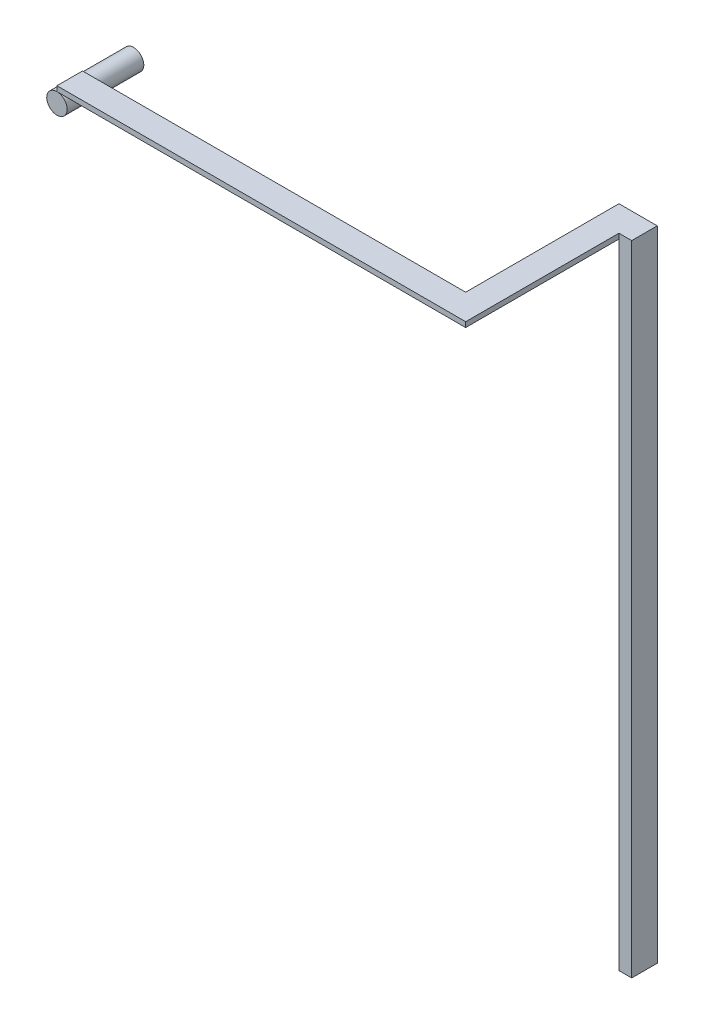
ISO-10303-21;
HEADER;
FILE_DESCRIPTION(('STEP AP214'),'2;1');
FILE_NAME('part.step','',(''),(''),'','','');
FILE_SCHEMA(('AUTOMOTIVE_DESIGN { 1 0 10303 214 1 1 1 1 }'));
ENDSEC;
DATA;
#1=APPLICATION_CONTEXT('core data for automotive mechanical design processes');
#2=APPLICATION_PROTOCOL_DEFINITION('international standard','automotive_design',2000,#1);
#3=PRODUCT_CONTEXT('',#1,'mechanical');
#4=PRODUCT('Part','Part','',(#3));
#5=PRODUCT_RELATED_PRODUCT_CATEGORY('part','',(#4));
#6=PRODUCT_DEFINITION_FORMATION('','',#4);
#7=PRODUCT_DEFINITION_CONTEXT('part definition',#1,'design');
#8=PRODUCT_DEFINITION('design','',#6,#7);
#9=PRODUCT_DEFINITION_SHAPE('','',#8);
#10=(LENGTH_UNIT() NAMED_UNIT(*) SI_UNIT(.MILLI.,.METRE.));
#11=(NAMED_UNIT(*) PLANE_ANGLE_UNIT() SI_UNIT($,.RADIAN.));
#12=(NAMED_UNIT(*) SI_UNIT($,.STERADIAN.) SOLID_ANGLE_UNIT());
#13=UNCERTAINTY_MEASURE_WITH_UNIT(LENGTH_MEASURE(1.E-05),#10,'distance_accuracy_value','');
#14=(GEOMETRIC_REPRESENTATION_CONTEXT(3) GLOBAL_UNCERTAINTY_ASSIGNED_CONTEXT((#13)) GLOBAL_UNIT_ASSIGNED_CONTEXT((#10,
#11,#12)) REPRESENTATION_CONTEXT('',''));
#15=CARTESIAN_POINT('',(0.,0.,0.));
#16=DIRECTION('',(0.,0.,1.));
#17=DIRECTION('',(1.,0.,0.));
#18=AXIS2_PLACEMENT_3D('',#15,#16,#17);
#19=CARTESIAN_POINT('',(0.,4.,20.));
#20=DIRECTION('',(-1.,0.,0.));
#21=DIRECTION('',(0.,0.,1.));
#22=AXIS2_PLACEMENT_3D('',#19,#20,#21);
#23=PLANE('',#22);
#24=DIRECTION('',(0.,-1.,0.));
#25=VECTOR('',#24,1.);
#26=CARTESIAN_POINT('',(0.,4.,30.));
#27=LINE('',#26,#25);
#28=CARTESIAN_POINT('',(0.,6.,30.));
#29=VERTEX_POINT('',#28);
#30=CARTESIAN_POINT('',(0.,4.,30.));
#31=VERTEX_POINT('',#30);
#32=EDGE_CURVE('E169',#29,#31,#27,.T.);
#33=ORIENTED_EDGE('',*,*,#32,.F.);
#34=DIRECTION('',(0.,0.,1.));
#35=VECTOR('',#34,1.);
#36=CARTESIAN_POINT('',(0.,6.,20.));
#37=LINE('',#36,#35);
#38=CARTESIAN_POINT('',(0.,6.,20.));
#39=VERTEX_POINT('',#38);
#40=EDGE_CURVE('E12',#39,#29,#37,.T.);
#41=ORIENTED_EDGE('',*,*,#40,.F.);
#42=DIRECTION('',(0.,-1.,0.));
#43=VECTOR('',#42,1.);
#44=CARTESIAN_POINT('',(0.,4.,20.));
#45=LINE('',#44,#43);
#46=CARTESIAN_POINT('',(0.,4.,20.));
#47=VERTEX_POINT('',#46);
#48=EDGE_CURVE('E170',#39,#47,#45,.T.);
#49=ORIENTED_EDGE('',*,*,#48,.T.);
#50=DIRECTION('',(0.,0.,1.));
#51=VECTOR('',#50,1.);
#52=CARTESIAN_POINT('',(0.,4.,20.));
#53=LINE('',#52,#51);
#54=EDGE_CURVE('E44',#47,#31,#53,.T.);
#55=ORIENTED_EDGE('',*,*,#54,.T.);
#56=EDGE_LOOP('',(#33,#41,#49,#55));
#57=FACE_BOUND('',#56,.T.);
#58=ADVANCED_FACE('F41',(#57),#23,.T.);
#59=CARTESIAN_POINT('',(0.,6.,20.));
#60=DIRECTION('',(0.,1.,0.));
#61=DIRECTION('',(0.,0.,1.));
#62=AXIS2_PLACEMENT_3D('',#59,#60,#61);
#63=PLANE('',#62);
#64=DIRECTION('',(-1.,0.,0.));
#65=VECTOR('',#64,1.);
#66=CARTESIAN_POINT('',(0.,6.,30.));
#67=LINE('',#66,#65);
#68=CARTESIAN_POINT('',(160.,6.,30.));
#69=VERTEX_POINT('',#68);
#70=EDGE_CURVE('E174',#69,#29,#67,.T.);
#71=ORIENTED_EDGE('',*,*,#70,.F.);
#72=DIRECTION('',(0.,0.,1.));
#73=VECTOR('',#72,1.);
#74=CARTESIAN_POINT('',(160.,6.,20.));
#75=LINE('',#74,#73);
#76=CARTESIAN_POINT('',(160.,6.,-30.));
#77=VERTEX_POINT('',#76);
#78=EDGE_CURVE('E49',#77,#69,#75,.T.);
#79=ORIENTED_EDGE('',*,*,#78,.F.);
#80=DIRECTION('',(-1.,0.,0.));
#81=VECTOR('',#80,1.);
#82=CARTESIAN_POINT('',(165.,6.,-30.));
#83=LINE('',#82,#81);
#84=CARTESIAN_POINT('',(165.,6.,-30.));
#85=VERTEX_POINT('',#84);
#86=EDGE_CURVE('E135',#85,#77,#83,.T.);
#87=ORIENTED_EDGE('',*,*,#86,.F.);
#88=DIRECTION('',(0.,0.,1.));
#89=VECTOR('',#88,1.);
#90=CARTESIAN_POINT('',(165.,6.,-40.));
#91=LINE('',#90,#89);
#92=CARTESIAN_POINT('',(165.,6.,-40.));
#93=VERTEX_POINT('',#92);
#94=EDGE_CURVE('E131',#93,#85,#91,.T.);
#95=ORIENTED_EDGE('',*,*,#94,.F.);
#96=DIRECTION('',(1.,0.,0.));
#97=VECTOR('',#96,1.);
#98=CARTESIAN_POINT('',(150.,6.,-40.));
#99=LINE('',#98,#97);
#100=CARTESIAN_POINT('',(150.,6.,-40.));
#101=VERTEX_POINT('',#100);
#102=EDGE_CURVE('E117',#101,#93,#99,.T.);
#103=ORIENTED_EDGE('',*,*,#102,.F.);
#104=DIRECTION('',(0.,0.,1.));
#105=VECTOR('',#104,1.);
#106=CARTESIAN_POINT('',(150.,6.,-40.));
#107=LINE('',#106,#105);
#108=CARTESIAN_POINT('',(150.,6.,20.));
#109=VERTEX_POINT('',#108);
#110=EDGE_CURVE('E167',#101,#109,#107,.T.);
#111=ORIENTED_EDGE('',*,*,#110,.T.);
#112=DIRECTION('',(-1.,0.,0.));
#113=VECTOR('',#112,1.);
#114=CARTESIAN_POINT('',(0.,6.,20.));
#115=LINE('',#114,#113);
#116=EDGE_CURVE('E176',#109,#39,#115,.T.);
#117=ORIENTED_EDGE('',*,*,#116,.T.);
#118=ORIENTED_EDGE('',*,*,#40,.T.);
#119=EDGE_LOOP('',(#71,#79,#87,#95,#103,#111,#117,#118));
#120=FACE_BOUND('',#119,.T.);
#121=ADVANCED_FACE('F133',(#120),#63,.T.);
#122=CARTESIAN_POINT('',(160.,4.,20.));
#123=DIRECTION('',(1.,0.,0.));
#124=DIRECTION('',(0.,0.,-1.));
#125=AXIS2_PLACEMENT_3D('',#122,#123,#124);
#126=PLANE('',#125);
#127=DIRECTION('',(0.,-1.,0.));
#128=VECTOR('',#127,1.);
#129=CARTESIAN_POINT('',(160.,6.,-30.));
#130=LINE('',#129,#128);
#131=CARTESIAN_POINT('',(160.,4.,-30.));
#132=VERTEX_POINT('',#131);
#133=EDGE_CURVE('E57',#77,#132,#130,.T.);
#134=ORIENTED_EDGE('',*,*,#133,.F.);
#135=ORIENTED_EDGE('',*,*,#78,.T.);
#136=DIRECTION('',(0.,1.,0.));
#137=VECTOR('',#136,1.);
#138=CARTESIAN_POINT('',(160.,4.,30.));
#139=LINE('',#138,#137);
#140=CARTESIAN_POINT('',(160.,4.,30.));
#141=VERTEX_POINT('',#140);
#142=EDGE_CURVE('E183',#141,#69,#139,.T.);
#143=ORIENTED_EDGE('',*,*,#142,.F.);
#144=DIRECTION('',(0.,0.,1.));
#145=VECTOR('',#144,1.);
#146=CARTESIAN_POINT('',(160.,4.,20.));
#147=LINE('',#146,#145);
#148=EDGE_CURVE('E189',#132,#141,#147,.T.);
#149=ORIENTED_EDGE('',*,*,#148,.F.);
#150=EDGE_LOOP('',(#134,#135,#143,#149));
#151=FACE_BOUND('',#150,.T.);
#152=ADVANCED_FACE('F219',(#151),#126,.T.);
#153=CARTESIAN_POINT('',(0.,4.,20.));
#154=DIRECTION('',(0.,-1.,0.));
#155=DIRECTION('',(0.,0.,-1.));
#156=AXIS2_PLACEMENT_3D('',#153,#154,#155);
#157=PLANE('',#156);
#158=DIRECTION('',(1.,0.,0.));
#159=VECTOR('',#158,1.);
#160=CARTESIAN_POINT('',(0.,4.,30.));
#161=LINE('',#160,#159);
#162=EDGE_CURVE('E180',#31,#141,#161,.T.);
#163=ORIENTED_EDGE('',*,*,#162,.F.);
#164=ORIENTED_EDGE('',*,*,#54,.F.);
#165=DIRECTION('',(1.,0.,0.));
#166=VECTOR('',#165,1.);
#167=CARTESIAN_POINT('',(0.,4.,20.));
#168=LINE('',#167,#166);
#169=CARTESIAN_POINT('',(150.,4.,20.));
#170=VERTEX_POINT('',#169);
#171=EDGE_CURVE('E173',#47,#170,#168,.T.);
#172=ORIENTED_EDGE('',*,*,#171,.T.);
#173=DIRECTION('',(0.,0.,1.));
#174=VECTOR('',#173,1.);
#175=CARTESIAN_POINT('',(150.,3.99999999999999,-40.));
#176=LINE('',#175,#174);
#177=CARTESIAN_POINT('',(150.,3.99999999999999,-40.));
#178=VERTEX_POINT('',#177);
#179=EDGE_CURVE('E163',#178,#170,#176,.T.);
#180=ORIENTED_EDGE('',*,*,#179,.F.);
#181=DIRECTION('',(-1.,0.,0.));
#182=VECTOR('',#181,1.);
#183=CARTESIAN_POINT('',(150.,3.99999999999999,-40.));
#184=LINE('',#183,#182);
#185=CARTESIAN_POINT('',(160.,4.,-40.));
#186=VERTEX_POINT('',#185);
#187=EDGE_CURVE('E128',#186,#178,#184,.T.);
#188=ORIENTED_EDGE('',*,*,#187,.F.);
#189=EDGE_CURVE('E188',#186,#132,#147,.T.);
#190=ORIENTED_EDGE('',*,*,#189,.T.);
#191=ORIENTED_EDGE('',*,*,#148,.T.);
#192=EDGE_LOOP('',(#163,#164,#172,#180,#188,#190,#191));
#193=FACE_BOUND('',#192,.T.);
#194=ADVANCED_FACE('F198',(#193),#157,.T.);
#195=CARTESIAN_POINT('',(0.,0.,20.));
#196=DIRECTION('',(0.,0.,-1.));
#197=DIRECTION('',(-1.,0.,0.));
#198=AXIS2_PLACEMENT_3D('',#195,#196,#197);
#199=PLANE('',#198);
#200=DIRECTION('',(0.,1.,0.));
#201=VECTOR('',#200,1.);
#202=CARTESIAN_POINT('',(150.,6.,20.));
#203=LINE('',#202,#201);
#204=EDGE_CURVE('E65',#170,#109,#203,.T.);
#205=ORIENTED_EDGE('',*,*,#204,.F.);
#206=ORIENTED_EDGE('',*,*,#171,.F.);
#207=ORIENTED_EDGE('',*,*,#48,.F.);
#208=ORIENTED_EDGE('',*,*,#116,.F.);
#209=EDGE_LOOP('',(#205,#206,#207,#208));
#210=FACE_BOUND('',#209,.T.);
#211=ADVANCED_FACE('F201',(#210),#199,.T.);
#212=CARTESIAN_POINT('',(0.,0.,30.));
#213=DIRECTION('',(0.,0.,-1.));
#214=DIRECTION('',(-1.,0.,0.));
#215=AXIS2_PLACEMENT_3D('',#212,#213,#214);
#216=PLANE('',#215);
#217=ORIENTED_EDGE('',*,*,#32,.T.);
#218=ORIENTED_EDGE('',*,*,#162,.T.);
#219=ORIENTED_EDGE('',*,*,#142,.T.);
#220=ORIENTED_EDGE('',*,*,#70,.T.);
#221=EDGE_LOOP('',(#217,#218,#219,#220));
#222=FACE_BOUND('',#221,.T.);
#223=ADVANCED_FACE('F200',(#222),#216,.F.);
#224=CARTESIAN_POINT('',(150.,6.,-40.));
#225=DIRECTION('',(1.,0.,0.));
#226=DIRECTION('',(0.,0.,-1.));
#227=AXIS2_PLACEMENT_3D('',#224,#225,#226);
#228=PLANE('',#227);
#229=ORIENTED_EDGE('',*,*,#204,.T.);
#230=ORIENTED_EDGE('',*,*,#110,.F.);
#231=DIRECTION('',(0.,1.,0.));
#232=VECTOR('',#231,1.);
#233=CARTESIAN_POINT('',(150.,6.,-40.));
#234=LINE('',#233,#232);
#235=EDGE_CURVE('E124',#178,#101,#234,.T.);
#236=ORIENTED_EDGE('',*,*,#235,.F.);
#237=ORIENTED_EDGE('',*,*,#179,.T.);
#238=EDGE_LOOP('',(#229,#230,#236,#237));
#239=FACE_BOUND('',#238,.T.);
#240=ADVANCED_FACE('F204',(#239),#228,.F.);
#241=CARTESIAN_POINT('',(0.,0.,-40.));
#242=DIRECTION('',(0.,0.,1.));
#243=DIRECTION('',(1.,0.,0.));
#244=AXIS2_PLACEMENT_3D('',#241,#242,#243);
#245=PLANE('',#244);
#246=ORIENTED_EDGE('',*,*,#235,.T.);
#247=ORIENTED_EDGE('',*,*,#102,.T.);
#248=DIRECTION('',(0.,1.,0.));
#249=VECTOR('',#248,1.);
#250=CARTESIAN_POINT('',(165.,6.,-40.));
#251=LINE('',#250,#249);
#252=CARTESIAN_POINT('',(165.,-244.,-40.));
#253=VERTEX_POINT('',#252);
#254=EDGE_CURVE('E122',#253,#93,#251,.T.);
#255=ORIENTED_EDGE('',*,*,#254,.F.);
#256=DIRECTION('',(-1.,0.,0.));
#257=VECTOR('',#256,1.);
#258=CARTESIAN_POINT('',(165.,-244.,-40.));
#259=LINE('',#258,#257);
#260=CARTESIAN_POINT('',(160.,-244.,-40.));
#261=VERTEX_POINT('',#260);
#262=EDGE_CURVE('E150',#253,#261,#259,.T.);
#263=ORIENTED_EDGE('',*,*,#262,.T.);
#264=DIRECTION('',(0.,1.,0.));
#265=VECTOR('',#264,1.);
#266=CARTESIAN_POINT('',(160.,6.,-40.));
#267=LINE('',#266,#265);
#268=EDGE_CURVE('E151',#261,#186,#267,.T.);
#269=ORIENTED_EDGE('',*,*,#268,.T.);
#270=ORIENTED_EDGE('',*,*,#187,.T.);
#271=EDGE_LOOP('',(#246,#247,#255,#263,#269,#270));
#272=FACE_BOUND('',#271,.T.);
#273=ADVANCED_FACE('F119',(#272),#245,.F.);
#274=CARTESIAN_POINT('',(160.,0.,0.));
#275=DIRECTION('',(-1.,0.,0.));
#276=DIRECTION('',(0.,0.,1.));
#277=AXIS2_PLACEMENT_3D('',#274,#275,#276);
#278=PLANE('',#277);
#279=ORIENTED_EDGE('',*,*,#189,.F.);
#280=ORIENTED_EDGE('',*,*,#268,.F.);
#281=DIRECTION('',(0.,0.,-1.));
#282=VECTOR('',#281,1.);
#283=CARTESIAN_POINT('',(160.,-244.,-40.));
#284=LINE('',#283,#282);
#285=CARTESIAN_POINT('',(160.,-244.,-30.));
#286=VERTEX_POINT('',#285);
#287=EDGE_CURVE('E144',#286,#261,#284,.T.);
#288=ORIENTED_EDGE('',*,*,#287,.F.);
#289=EDGE_CURVE('E154',#132,#286,#130,.T.);
#290=ORIENTED_EDGE('',*,*,#289,.F.);
#291=EDGE_LOOP('',(#279,#280,#288,#290));
#292=FACE_BOUND('',#291,.T.);
#293=ADVANCED_FACE('F211',(#292),#278,.T.);
#294=CARTESIAN_POINT('',(165.,6.,-30.));
#295=DIRECTION('',(0.,0.,-1.));
#296=DIRECTION('',(0.,1.,0.));
#297=AXIS2_PLACEMENT_3D('',#294,#295,#296);
#298=PLANE('',#297);
#299=ORIENTED_EDGE('',*,*,#133,.T.);
#300=ORIENTED_EDGE('',*,*,#289,.T.);
#301=DIRECTION('',(-1.,0.,0.));
#302=VECTOR('',#301,1.);
#303=CARTESIAN_POINT('',(165.,-244.,-30.));
#304=LINE('',#303,#302);
#305=CARTESIAN_POINT('',(165.,-244.,-30.));
#306=VERTEX_POINT('',#305);
#307=EDGE_CURVE('E157',#306,#286,#304,.T.);
#308=ORIENTED_EDGE('',*,*,#307,.F.);
#309=DIRECTION('',(0.,-1.,0.));
#310=VECTOR('',#309,1.);
#311=CARTESIAN_POINT('',(165.,6.,-30.));
#312=LINE('',#311,#310);
#313=EDGE_CURVE('E138',#85,#306,#312,.T.);
#314=ORIENTED_EDGE('',*,*,#313,.F.);
#315=ORIENTED_EDGE('',*,*,#86,.T.);
#316=EDGE_LOOP('',(#299,#300,#308,#314,#315));
#317=FACE_BOUND('',#316,.T.);
#318=ADVANCED_FACE('F289',(#317),#298,.F.);
#319=CARTESIAN_POINT('',(165.,-244.,-40.));
#320=DIRECTION('',(0.,1.,0.));
#321=DIRECTION('',(0.,0.,1.));
#322=AXIS2_PLACEMENT_3D('',#319,#320,#321);
#323=PLANE('',#322);
#324=ORIENTED_EDGE('',*,*,#287,.T.);
#325=ORIENTED_EDGE('',*,*,#262,.F.);
#326=DIRECTION('',(0.,0.,-1.));
#327=VECTOR('',#326,1.);
#328=CARTESIAN_POINT('',(165.,-244.,-40.));
#329=LINE('',#328,#327);
#330=EDGE_CURVE('E142',#306,#253,#329,.T.);
#331=ORIENTED_EDGE('',*,*,#330,.F.);
#332=ORIENTED_EDGE('',*,*,#307,.T.);
#333=EDGE_LOOP('',(#324,#325,#331,#332));
#334=FACE_BOUND('',#333,.T.);
#335=ADVANCED_FACE('F298',(#334),#323,.F.);
#336=CARTESIAN_POINT('',(165.,0.,0.));
#337=DIRECTION('',(-1.,0.,0.));
#338=DIRECTION('',(0.,0.,1.));
#339=AXIS2_PLACEMENT_3D('',#336,#337,#338);
#340=PLANE('',#339);
#341=ORIENTED_EDGE('',*,*,#254,.T.);
#342=ORIENTED_EDGE('',*,*,#94,.T.);
#343=ORIENTED_EDGE('',*,*,#313,.T.);
#344=ORIENTED_EDGE('',*,*,#330,.T.);
#345=EDGE_LOOP('',(#341,#342,#343,#344));
#346=FACE_BOUND('',#345,.T.);
#347=ADVANCED_FACE('F140',(#346),#340,.F.);
#348=CLOSED_SHELL('',(#58,#121,#152,#194,#211,#223,#240,#273,#293,#318,#335,#347));
#349=MANIFOLD_SOLID_BREP('B2',#348);
#350=CARTESIAN_POINT('',(0.,0.,30.));
#351=DIRECTION('',(0.,0.,-1.));
#352=DIRECTION('',(-1.,0.,0.));
#353=AXIS2_PLACEMENT_3D('',#350,#351,#352);
#354=CYLINDRICAL_SURFACE('',#353,4.);
#355=CARTESIAN_POINT('',(0.,0.,30.));
#356=DIRECTION('',(0.,0.,1.));
#357=DIRECTION('',(1.,0.,0.));
#358=AXIS2_PLACEMENT_3D('',#355,#356,#357);
#359=CIRCLE('',#358,4.);
#360=CARTESIAN_POINT('',(4.,0.,30.));
#361=VERTEX_POINT('',#360);
#362=EDGE_CURVE('E40',#361,#361,#359,.T.);
#363=ORIENTED_EDGE('',*,*,#362,.F.);
#364=EDGE_LOOP('',(#363));
#365=FACE_BOUND('',#364,.T.);
#366=CARTESIAN_POINT('',(0.,0.,0.));
#367=DIRECTION('',(0.,0.,1.));
#368=DIRECTION('',(1.,0.,0.));
#369=AXIS2_PLACEMENT_3D('',#366,#367,#368);
#370=CIRCLE('',#369,4.);
#371=CARTESIAN_POINT('',(4.,0.,0.));
#372=VERTEX_POINT('',#371);
#373=EDGE_CURVE('E331',#372,#372,#370,.T.);
#374=ORIENTED_EDGE('',*,*,#373,.T.);
#375=EDGE_LOOP('',(#374));
#376=FACE_BOUND('',#375,.T.);
#377=ADVANCED_FACE('F328',(#365,#376),#354,.T.);
#378=CARTESIAN_POINT('',(0.,0.,30.));
#379=DIRECTION('',(0.,0.,1.));
#380=DIRECTION('',(1.,0.,0.));
#381=AXIS2_PLACEMENT_3D('',#378,#379,#380);
#382=PLANE('',#381);
#383=ORIENTED_EDGE('',*,*,#362,.T.);
#384=EDGE_LOOP('',(#383));
#385=FACE_BOUND('',#384,.T.);
#386=ADVANCED_FACE('F343',(#385),#382,.T.);
#387=CARTESIAN_POINT('',(0.,0.,0.));
#388=DIRECTION('',(0.,0.,1.));
#389=DIRECTION('',(1.,0.,0.));
#390=AXIS2_PLACEMENT_3D('',#387,#388,#389);
#391=PLANE('',#390);
#392=ORIENTED_EDGE('',*,*,#373,.F.);
#393=EDGE_LOOP('',(#392));
#394=FACE_BOUND('',#393,.T.);
#395=ADVANCED_FACE('F341',(#394),#391,.F.);
#396=CLOSED_SHELL('',(#377,#386,#395));
#397=MANIFOLD_SOLID_BREP('B6',#396);
#398=ADVANCED_BREP_SHAPE_REPRESENTATION('',(#18,#349,#397),#14);
#399=SHAPE_DEFINITION_REPRESENTATION(#9,#398);
ENDSEC;
END-ISO-10303-21;
